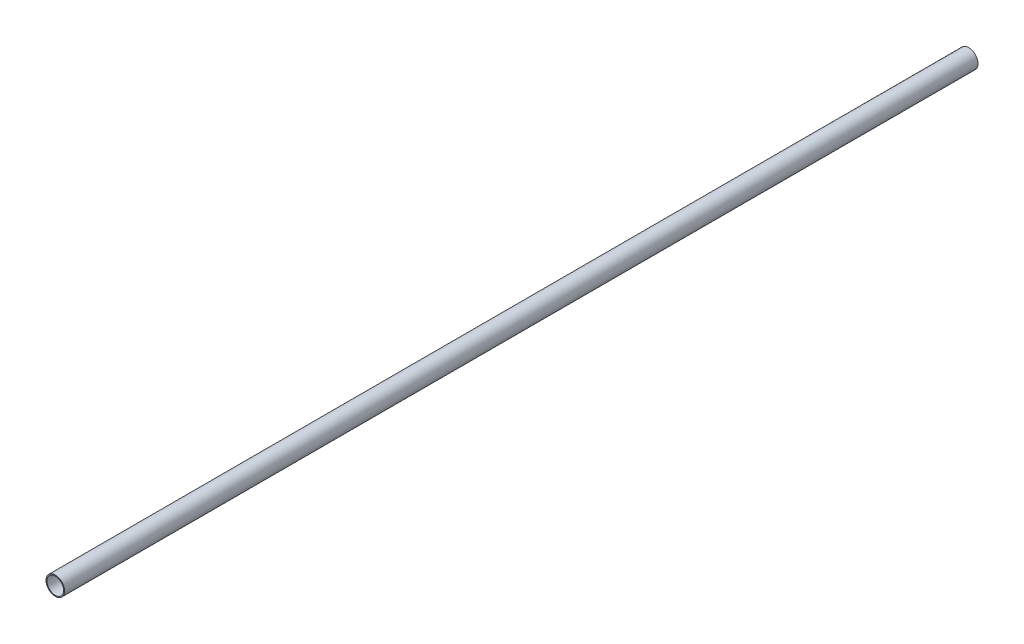
ISO-10303-21;
HEADER;
FILE_DESCRIPTION(('STEP AP214'),'2;1');
FILE_NAME('part.step','',(''),(''),'','','');
FILE_SCHEMA(('AUTOMOTIVE_DESIGN { 1 0 10303 214 1 1 1 1 }'));
ENDSEC;
DATA;
#1=APPLICATION_CONTEXT('core data for automotive mechanical design processes');
#2=APPLICATION_PROTOCOL_DEFINITION('international standard','automotive_design',2000,#1);
#3=PRODUCT_CONTEXT('',#1,'mechanical');
#4=PRODUCT('Part','Part','',(#3));
#5=PRODUCT_RELATED_PRODUCT_CATEGORY('part','',(#4));
#6=PRODUCT_DEFINITION_FORMATION('','',#4);
#7=PRODUCT_DEFINITION_CONTEXT('part definition',#1,'design');
#8=PRODUCT_DEFINITION('design','',#6,#7);
#9=PRODUCT_DEFINITION_SHAPE('','',#8);
#10=(LENGTH_UNIT() NAMED_UNIT(*) SI_UNIT(.MILLI.,.METRE.));
#11=(NAMED_UNIT(*) PLANE_ANGLE_UNIT() SI_UNIT($,.RADIAN.));
#12=(NAMED_UNIT(*) SI_UNIT($,.STERADIAN.) SOLID_ANGLE_UNIT());
#13=UNCERTAINTY_MEASURE_WITH_UNIT(LENGTH_MEASURE(1.E-05),#10,'distance_accuracy_value','');
#14=(GEOMETRIC_REPRESENTATION_CONTEXT(3) GLOBAL_UNCERTAINTY_ASSIGNED_CONTEXT((#13)) GLOBAL_UNIT_ASSIGNED_CONTEXT((#10,
#11,#12)) REPRESENTATION_CONTEXT('',''));
#15=CARTESIAN_POINT('',(0.,0.,0.));
#16=DIRECTION('',(0.,0.,1.));
#17=DIRECTION('',(1.,0.,0.));
#18=AXIS2_PLACEMENT_3D('',#15,#16,#17);
#19=CARTESIAN_POINT('',(0.,0.,492.));
#20=DIRECTION('',(0.,0.,1.));
#21=DIRECTION('',(1.,0.,0.));
#22=AXIS2_PLACEMENT_3D('',#19,#20,#21);
#23=PLANE('',#22);
#24=CARTESIAN_POINT('',(0.,0.,492.));
#25=DIRECTION('',(0.,0.,1.));
#26=DIRECTION('',(1.,0.,0.));
#27=AXIS2_PLACEMENT_3D('',#24,#25,#26);
#28=CIRCLE('',#27,5.);
#29=CARTESIAN_POINT('',(5.,0.,492.));
#30=VERTEX_POINT('',#29);
#31=EDGE_CURVE('E10',#30,#30,#28,.T.);
#32=ORIENTED_EDGE('',*,*,#31,.T.);
#33=EDGE_LOOP('',(#32));
#34=FACE_BOUND('',#33,.T.);
#35=CARTESIAN_POINT('',(0.,0.,492.));
#36=DIRECTION('',(0.,0.,1.));
#37=DIRECTION('',(1.,0.,0.));
#38=AXIS2_PLACEMENT_3D('',#35,#36,#37);
#39=CIRCLE('',#38,4.5);
#40=CARTESIAN_POINT('',(4.5,0.,492.));
#41=VERTEX_POINT('',#40);
#42=EDGE_CURVE('E50',#41,#41,#39,.T.);
#43=ORIENTED_EDGE('',*,*,#42,.F.);
#44=EDGE_LOOP('',(#43));
#45=FACE_BOUND('',#44,.T.);
#46=ADVANCED_FACE('F37',(#34,#45),#23,.T.);
#47=CARTESIAN_POINT('',(0.,0.,0.));
#48=DIRECTION('',(0.,0.,1.));
#49=DIRECTION('',(1.,0.,0.));
#50=AXIS2_PLACEMENT_3D('',#47,#48,#49);
#51=PLANE('',#50);
#52=CARTESIAN_POINT('',(0.,0.,0.));
#53=DIRECTION('',(0.,0.,1.));
#54=DIRECTION('',(1.,0.,0.));
#55=AXIS2_PLACEMENT_3D('',#52,#53,#54);
#56=CIRCLE('',#55,5.);
#57=CARTESIAN_POINT('',(5.,0.,0.));
#58=VERTEX_POINT('',#57);
#59=EDGE_CURVE('E41',#58,#58,#56,.T.);
#60=ORIENTED_EDGE('',*,*,#59,.F.);
#61=EDGE_LOOP('',(#60));
#62=FACE_BOUND('',#61,.T.);
#63=CARTESIAN_POINT('',(0.,0.,0.));
#64=DIRECTION('',(0.,0.,1.));
#65=DIRECTION('',(1.,0.,0.));
#66=AXIS2_PLACEMENT_3D('',#63,#64,#65);
#67=CIRCLE('',#66,4.5);
#68=CARTESIAN_POINT('',(4.5,0.,0.));
#69=VERTEX_POINT('',#68);
#70=EDGE_CURVE('E52',#69,#69,#67,.T.);
#71=ORIENTED_EDGE('',*,*,#70,.T.);
#72=EDGE_LOOP('',(#71));
#73=FACE_BOUND('',#72,.T.);
#74=ADVANCED_FACE('F64',(#62,#73),#51,.F.);
#75=CARTESIAN_POINT('',(0.,0.,492.));
#76=DIRECTION('',(0.,0.,-1.));
#77=DIRECTION('',(-1.,0.,0.));
#78=AXIS2_PLACEMENT_3D('',#75,#76,#77);
#79=CYLINDRICAL_SURFACE('',#78,5.);
#80=ORIENTED_EDGE('',*,*,#31,.F.);
#81=EDGE_LOOP('',(#80));
#82=FACE_BOUND('',#81,.T.);
#83=ORIENTED_EDGE('',*,*,#59,.T.);
#84=EDGE_LOOP('',(#83));
#85=FACE_BOUND('',#84,.T.);
#86=ADVANCED_FACE('F39',(#82,#85),#79,.T.);
#87=CARTESIAN_POINT('',(0.,0.,492.));
#88=DIRECTION('',(0.,0.,-1.));
#89=DIRECTION('',(-1.,0.,0.));
#90=AXIS2_PLACEMENT_3D('',#87,#88,#89);
#91=CYLINDRICAL_SURFACE('',#90,4.5);
#92=ORIENTED_EDGE('',*,*,#42,.T.);
#93=EDGE_LOOP('',(#92));
#94=FACE_BOUND('',#93,.T.);
#95=ORIENTED_EDGE('',*,*,#70,.F.);
#96=EDGE_LOOP('',(#95));
#97=FACE_BOUND('',#96,.T.);
#98=ADVANCED_FACE('F60',(#94,#97),#91,.F.);
#99=CLOSED_SHELL('',(#46,#74,#86,#98));
#100=MANIFOLD_SOLID_BREP('B2',#99);
#101=ADVANCED_BREP_SHAPE_REPRESENTATION('',(#18,#100),#14);
#102=SHAPE_DEFINITION_REPRESENTATION(#9,#101);
ENDSEC;
END-ISO-10303-21;
